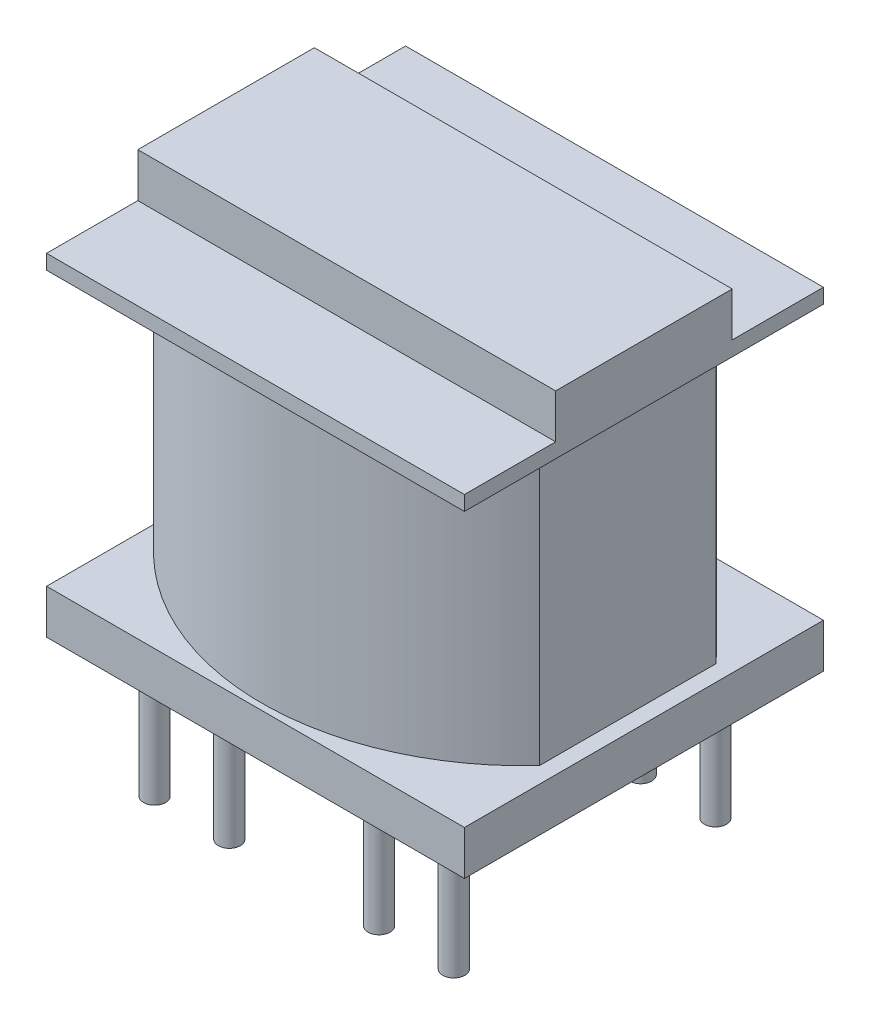
ISO-10303-21;
HEADER;
FILE_DESCRIPTION(('STEP AP214'),'2;1');
FILE_NAME('part.step','',(''),(''),'','','');
FILE_SCHEMA(('AUTOMOTIVE_DESIGN { 1 0 10303 214 1 1 1 1 }'));
ENDSEC;
DATA;
#1=APPLICATION_CONTEXT('core data for automotive mechanical design processes');
#2=APPLICATION_PROTOCOL_DEFINITION('international standard','automotive_design',2000,#1);
#3=PRODUCT_CONTEXT('',#1,'mechanical');
#4=PRODUCT('Part','Part','',(#3));
#5=PRODUCT_RELATED_PRODUCT_CATEGORY('part','',(#4));
#6=PRODUCT_DEFINITION_FORMATION('','',#4);
#7=PRODUCT_DEFINITION_CONTEXT('part definition',#1,'design');
#8=PRODUCT_DEFINITION('design','',#6,#7);
#9=PRODUCT_DEFINITION_SHAPE('','',#8);
#10=(LENGTH_UNIT() NAMED_UNIT(*) SI_UNIT(.MILLI.,.METRE.));
#11=(NAMED_UNIT(*) PLANE_ANGLE_UNIT() SI_UNIT($,.RADIAN.));
#12=(NAMED_UNIT(*) SI_UNIT($,.STERADIAN.) SOLID_ANGLE_UNIT());
#13=UNCERTAINTY_MEASURE_WITH_UNIT(LENGTH_MEASURE(1.E-05),#10,'distance_accuracy_value','');
#14=(GEOMETRIC_REPRESENTATION_CONTEXT(3) GLOBAL_UNCERTAINTY_ASSIGNED_CONTEXT((#13)) GLOBAL_UNIT_ASSIGNED_CONTEXT((#10,
#11,#12)) REPRESENTATION_CONTEXT('',''));
#15=CARTESIAN_POINT('',(0.,0.,0.));
#16=DIRECTION('',(0.,0.,1.));
#17=DIRECTION('',(1.,0.,0.));
#18=AXIS2_PLACEMENT_3D('',#15,#16,#17);
#19=CARTESIAN_POINT('',(0.,0.,0.));
#20=DIRECTION('',(0.,1.,0.));
#21=DIRECTION('',(0.,0.,1.));
#22=AXIS2_PLACEMENT_3D('',#19,#20,#21);
#23=PLANE('',#22);
#24=CARTESIAN_POINT('',(-2.54500000000001,0.,-4.445));
#25=DIRECTION('',(0.,1.,0.));
#26=DIRECTION('',(0.,0.,1.));
#27=AXIS2_PLACEMENT_3D('',#24,#25,#26);
#28=CIRCLE('',#27,0.375);
#29=CARTESIAN_POINT('',(-2.54500000000001,0.,-4.07));
#30=VERTEX_POINT('',#29);
#31=EDGE_CURVE('E47',#30,#30,#28,.F.);
#32=ORIENTED_EDGE('',*,*,#31,.F.);
#33=EDGE_LOOP('',(#32));
#34=FACE_BOUND('',#33,.T.);
#35=CARTESIAN_POINT('',(5.08499999999999,0.,-4.445));
#36=DIRECTION('',(0.,1.,0.));
#37=DIRECTION('',(0.,0.,1.));
#38=AXIS2_PLACEMENT_3D('',#35,#36,#37);
#39=CIRCLE('',#38,0.375);
#40=CARTESIAN_POINT('',(5.08499999999999,0.,-4.07));
#41=VERTEX_POINT('',#40);
#42=EDGE_CURVE('E276',#41,#41,#39,.F.);
#43=ORIENTED_EDGE('',*,*,#42,.F.);
#44=EDGE_LOOP('',(#43));
#45=FACE_BOUND('',#44,.T.);
#46=CARTESIAN_POINT('',(2.545,0.,4.445));
#47=DIRECTION('',(0.,1.,0.));
#48=DIRECTION('',(0.,0.,1.));
#49=AXIS2_PLACEMENT_3D('',#46,#47,#48);
#50=CIRCLE('',#49,0.375);
#51=CARTESIAN_POINT('',(2.545,0.,4.82));
#52=VERTEX_POINT('',#51);
#53=EDGE_CURVE('E270',#52,#52,#50,.F.);
#54=ORIENTED_EDGE('',*,*,#53,.F.);
#55=EDGE_LOOP('',(#54));
#56=FACE_BOUND('',#55,.T.);
#57=CARTESIAN_POINT('',(-5.085,0.,4.445));
#58=DIRECTION('',(0.,1.,0.));
#59=DIRECTION('',(0.,0.,1.));
#60=AXIS2_PLACEMENT_3D('',#57,#58,#59);
#61=CIRCLE('',#60,0.375);
#62=CARTESIAN_POINT('',(-5.085,0.,4.82));
#63=VERTEX_POINT('',#62);
#64=EDGE_CURVE('E264',#63,#63,#61,.F.);
#65=ORIENTED_EDGE('',*,*,#64,.F.);
#66=EDGE_LOOP('',(#65));
#67=FACE_BOUND('',#66,.T.);
#68=DIRECTION('',(0.,0.,1.));
#69=VECTOR('',#68,1.);
#70=CARTESIAN_POINT('',(-7.1,0.,-6.1));
#71=LINE('',#70,#69);
#72=CARTESIAN_POINT('',(-7.1,0.,-6.1));
#73=VERTEX_POINT('',#72);
#74=CARTESIAN_POINT('',(-7.1,0.,6.1));
#75=VERTEX_POINT('',#74);
#76=EDGE_CURVE('E226',#73,#75,#71,.T.);
#77=ORIENTED_EDGE('',*,*,#76,.F.);
#78=DIRECTION('',(-1.,0.,0.));
#79=VECTOR('',#78,1.);
#80=CARTESIAN_POINT('',(-7.1,0.,-6.1));
#81=LINE('',#80,#79);
#82=CARTESIAN_POINT('',(7.1,0.,-6.1));
#83=VERTEX_POINT('',#82);
#84=EDGE_CURVE('E222',#83,#73,#81,.T.);
#85=ORIENTED_EDGE('',*,*,#84,.F.);
#86=DIRECTION('',(0.,0.,-1.));
#87=VECTOR('',#86,1.);
#88=CARTESIAN_POINT('',(7.1,0.,-6.1));
#89=LINE('',#88,#87);
#90=CARTESIAN_POINT('',(7.1,0.,6.1));
#91=VERTEX_POINT('',#90);
#92=EDGE_CURVE('E232',#91,#83,#89,.T.);
#93=ORIENTED_EDGE('',*,*,#92,.F.);
#94=DIRECTION('',(1.,0.,0.));
#95=VECTOR('',#94,1.);
#96=CARTESIAN_POINT('',(-7.1,0.,6.1));
#97=LINE('',#96,#95);
#98=EDGE_CURVE('E229',#75,#91,#97,.T.);
#99=ORIENTED_EDGE('',*,*,#98,.F.);
#100=EDGE_LOOP('',(#77,#85,#93,#99));
#101=FACE_BOUND('',#100,.T.);
#102=CARTESIAN_POINT('',(-2.545,0.,4.445));
#103=DIRECTION('',(0.,1.,0.));
#104=DIRECTION('',(0.,0.,1.));
#105=AXIS2_PLACEMENT_3D('',#102,#103,#104);
#106=CIRCLE('',#105,0.375);
#107=CARTESIAN_POINT('',(-2.545,0.,4.82));
#108=VERTEX_POINT('',#107);
#109=EDGE_CURVE('E267',#108,#108,#106,.F.);
#110=ORIENTED_EDGE('',*,*,#109,.F.);
#111=EDGE_LOOP('',(#110));
#112=FACE_BOUND('',#111,.T.);
#113=CARTESIAN_POINT('',(5.085,0.,4.445));
#114=DIRECTION('',(0.,1.,0.));
#115=DIRECTION('',(0.,0.,1.));
#116=AXIS2_PLACEMENT_3D('',#113,#114,#115);
#117=CIRCLE('',#116,0.375);
#118=CARTESIAN_POINT('',(5.085,0.,4.82));
#119=VERTEX_POINT('',#118);
#120=EDGE_CURVE('E273',#119,#119,#117,.F.);
#121=ORIENTED_EDGE('',*,*,#120,.F.);
#122=EDGE_LOOP('',(#121));
#123=FACE_BOUND('',#122,.T.);
#124=CARTESIAN_POINT('',(2.54499999999999,0.,-4.445));
#125=DIRECTION('',(0.,1.,0.));
#126=DIRECTION('',(0.,0.,1.));
#127=AXIS2_PLACEMENT_3D('',#124,#125,#126);
#128=CIRCLE('',#127,0.375);
#129=CARTESIAN_POINT('',(2.54499999999999,0.,-4.07));
#130=VERTEX_POINT('',#129);
#131=EDGE_CURVE('E279',#130,#130,#128,.F.);
#132=ORIENTED_EDGE('',*,*,#131,.F.);
#133=EDGE_LOOP('',(#132));
#134=FACE_BOUND('',#133,.T.);
#135=CARTESIAN_POINT('',(-5.08500000000001,0.,-4.445));
#136=DIRECTION('',(0.,1.,0.));
#137=DIRECTION('',(0.,0.,1.));
#138=AXIS2_PLACEMENT_3D('',#135,#136,#137);
#139=CIRCLE('',#138,0.375);
#140=CARTESIAN_POINT('',(-5.08500000000001,0.,-4.07));
#141=VERTEX_POINT('',#140);
#142=EDGE_CURVE('E13',#141,#141,#139,.F.);
#143=ORIENTED_EDGE('',*,*,#142,.F.);
#144=EDGE_LOOP('',(#143));
#145=FACE_BOUND('',#144,.T.);
#146=ADVANCED_FACE('F39',(#34,#45,#56,#67,#101,#112,#123,#134,#145),#23,.F.);
#147=CARTESIAN_POINT('',(-7.1,12.8,-6.1));
#148=DIRECTION('',(1.,0.,0.));
#149=DIRECTION('',(0.,0.,-1.));
#150=AXIS2_PLACEMENT_3D('',#147,#148,#149);
#151=PLANE('',#150);
#152=DIRECTION('',(0.,-1.,0.));
#153=VECTOR('',#152,1.);
#154=CARTESIAN_POINT('',(-7.1,12.8,-6.1));
#155=LINE('',#154,#153);
#156=CARTESIAN_POINT('',(-7.1,11.3,-6.1));
#157=VERTEX_POINT('',#156);
#158=CARTESIAN_POINT('',(-7.1,10.8,-6.1));
#159=VERTEX_POINT('',#158);
#160=EDGE_CURVE('E237',#157,#159,#155,.T.);
#161=ORIENTED_EDGE('',*,*,#160,.T.);
#162=DIRECTION('',(0.,0.,1.));
#163=VECTOR('',#162,1.);
#164=CARTESIAN_POINT('',(-7.1,10.8,-6.1));
#165=LINE('',#164,#163);
#166=CARTESIAN_POINT('',(-7.1,10.8,6.1));
#167=VERTEX_POINT('',#166);
#168=EDGE_CURVE('E54',#159,#167,#165,.T.);
#169=ORIENTED_EDGE('',*,*,#168,.T.);
#170=DIRECTION('',(0.,-1.,0.));
#171=VECTOR('',#170,1.);
#172=CARTESIAN_POINT('',(-7.1,12.8,6.1));
#173=LINE('',#172,#171);
#174=CARTESIAN_POINT('',(-7.1,11.3,6.1));
#175=VERTEX_POINT('',#174);
#176=EDGE_CURVE('E249',#175,#167,#173,.T.);
#177=ORIENTED_EDGE('',*,*,#176,.F.);
#178=DIRECTION('',(0.,0.,1.));
#179=VECTOR('',#178,1.);
#180=CARTESIAN_POINT('',(-7.1,11.3,-6.1));
#181=LINE('',#180,#179);
#182=CARTESIAN_POINT('',(-7.1,11.3,3.));
#183=VERTEX_POINT('',#182);
#184=EDGE_CURVE('E215',#183,#175,#181,.T.);
#185=ORIENTED_EDGE('',*,*,#184,.F.);
#186=DIRECTION('',(0.,-1.,0.));
#187=VECTOR('',#186,1.);
#188=CARTESIAN_POINT('',(-7.1,12.8,3.));
#189=LINE('',#188,#187);
#190=CARTESIAN_POINT('',(-7.1,12.8,3.));
#191=VERTEX_POINT('',#190);
#192=EDGE_CURVE('E204',#191,#183,#189,.T.);
#193=ORIENTED_EDGE('',*,*,#192,.F.);
#194=DIRECTION('',(0.,0.,1.));
#195=VECTOR('',#194,1.);
#196=CARTESIAN_POINT('',(-7.1,12.8,-6.1));
#197=LINE('',#196,#195);
#198=CARTESIAN_POINT('',(-7.1,12.8,-3.));
#199=VERTEX_POINT('',#198);
#200=EDGE_CURVE('E218',#199,#191,#197,.T.);
#201=ORIENTED_EDGE('',*,*,#200,.F.);
#202=DIRECTION('',(0.,1.,0.));
#203=VECTOR('',#202,1.);
#204=CARTESIAN_POINT('',(-7.1,12.8,-3.));
#205=LINE('',#204,#203);
#206=CARTESIAN_POINT('',(-7.1,11.3,-3.));
#207=VERTEX_POINT('',#206);
#208=EDGE_CURVE('E208',#207,#199,#205,.T.);
#209=ORIENTED_EDGE('',*,*,#208,.F.);
#210=EDGE_CURVE('E212',#157,#207,#181,.T.);
#211=ORIENTED_EDGE('',*,*,#210,.F.);
#212=EDGE_LOOP('',(#161,#169,#177,#185,#193,#201,#209,#211));
#213=FACE_BOUND('',#212,.T.);
#214=ADVANCED_FACE('F41',(#213),#151,.F.);
#215=CARTESIAN_POINT('',(-7.1,12.8,6.1));
#216=DIRECTION('',(0.,0.,-1.));
#217=DIRECTION('',(-1.,0.,0.));
#218=AXIS2_PLACEMENT_3D('',#215,#216,#217);
#219=PLANE('',#218);
#220=ORIENTED_EDGE('',*,*,#176,.T.);
#221=DIRECTION('',(1.,0.,0.));
#222=VECTOR('',#221,1.);
#223=CARTESIAN_POINT('',(-7.1,10.8,6.1));
#224=LINE('',#223,#222);
#225=CARTESIAN_POINT('',(7.1,10.8,6.1));
#226=VERTEX_POINT('',#225);
#227=EDGE_CURVE('E187',#167,#226,#224,.T.);
#228=ORIENTED_EDGE('',*,*,#227,.T.);
#229=DIRECTION('',(0.,-1.,0.));
#230=VECTOR('',#229,1.);
#231=CARTESIAN_POINT('',(7.1,12.8,6.1));
#232=LINE('',#231,#230);
#233=CARTESIAN_POINT('',(7.1,11.3,6.1));
#234=VERTEX_POINT('',#233);
#235=EDGE_CURVE('E245',#234,#226,#232,.T.);
#236=ORIENTED_EDGE('',*,*,#235,.F.);
#237=DIRECTION('',(1.,0.,0.));
#238=VECTOR('',#237,1.);
#239=CARTESIAN_POINT('',(-7.1,11.3,6.1));
#240=LINE('',#239,#238);
#241=EDGE_CURVE('E216',#175,#234,#240,.T.);
#242=ORIENTED_EDGE('',*,*,#241,.F.);
#243=EDGE_LOOP('',(#220,#228,#236,#242));
#244=FACE_BOUND('',#243,.T.);
#245=ADVANCED_FACE('F417',(#244),#219,.F.);
#246=CARTESIAN_POINT('',(7.1,12.8,-6.1));
#247=DIRECTION('',(-1.,0.,0.));
#248=DIRECTION('',(0.,0.,1.));
#249=AXIS2_PLACEMENT_3D('',#246,#247,#248);
#250=PLANE('',#249);
#251=ORIENTED_EDGE('',*,*,#235,.T.);
#252=DIRECTION('',(0.,0.,-1.));
#253=VECTOR('',#252,1.);
#254=CARTESIAN_POINT('',(7.1,10.8,-6.1));
#255=LINE('',#254,#253);
#256=CARTESIAN_POINT('',(7.1,10.8,-6.1));
#257=VERTEX_POINT('',#256);
#258=EDGE_CURVE('E162',#226,#257,#255,.T.);
#259=ORIENTED_EDGE('',*,*,#258,.T.);
#260=DIRECTION('',(0.,-1.,0.));
#261=VECTOR('',#260,1.);
#262=CARTESIAN_POINT('',(7.1,12.8,-6.1));
#263=LINE('',#262,#261);
#264=CARTESIAN_POINT('',(7.1,11.3,-6.1));
#265=VERTEX_POINT('',#264);
#266=EDGE_CURVE('E241',#265,#257,#263,.T.);
#267=ORIENTED_EDGE('',*,*,#266,.F.);
#268=DIRECTION('',(0.,0.,-1.));
#269=VECTOR('',#268,1.);
#270=CARTESIAN_POINT('',(7.1,11.3,-6.1));
#271=LINE('',#270,#269);
#272=CARTESIAN_POINT('',(7.1,11.3,-3.));
#273=VERTEX_POINT('',#272);
#274=EDGE_CURVE('E210',#273,#265,#271,.T.);
#275=ORIENTED_EDGE('',*,*,#274,.F.);
#276=DIRECTION('',(0.,-1.,0.));
#277=VECTOR('',#276,1.);
#278=CARTESIAN_POINT('',(7.1,12.8,-3.));
#279=LINE('',#278,#277);
#280=CARTESIAN_POINT('',(7.1,12.8,-3.));
#281=VERTEX_POINT('',#280);
#282=EDGE_CURVE('E206',#281,#273,#279,.T.);
#283=ORIENTED_EDGE('',*,*,#282,.F.);
#284=DIRECTION('',(0.,0.,-1.));
#285=VECTOR('',#284,1.);
#286=CARTESIAN_POINT('',(7.1,12.8,-6.1));
#287=LINE('',#286,#285);
#288=CARTESIAN_POINT('',(7.1,12.8,3.));
#289=VERTEX_POINT('',#288);
#290=EDGE_CURVE('E221',#289,#281,#287,.T.);
#291=ORIENTED_EDGE('',*,*,#290,.F.);
#292=DIRECTION('',(0.,1.,0.));
#293=VECTOR('',#292,1.);
#294=CARTESIAN_POINT('',(7.1,12.8,3.));
#295=LINE('',#294,#293);
#296=CARTESIAN_POINT('',(7.1,11.3,3.));
#297=VERTEX_POINT('',#296);
#298=EDGE_CURVE('E202',#297,#289,#295,.T.);
#299=ORIENTED_EDGE('',*,*,#298,.F.);
#300=EDGE_CURVE('E213',#234,#297,#271,.T.);
#301=ORIENTED_EDGE('',*,*,#300,.F.);
#302=EDGE_LOOP('',(#251,#259,#267,#275,#283,#291,#299,#301));
#303=FACE_BOUND('',#302,.T.);
#304=ADVANCED_FACE('F414',(#303),#250,.F.);
#305=CARTESIAN_POINT('',(-7.1,12.8,-6.1));
#306=DIRECTION('',(0.,0.,1.));
#307=DIRECTION('',(1.,0.,0.));
#308=AXIS2_PLACEMENT_3D('',#305,#306,#307);
#309=PLANE('',#308);
#310=ORIENTED_EDGE('',*,*,#266,.T.);
#311=DIRECTION('',(-1.,0.,0.));
#312=VECTOR('',#311,1.);
#313=CARTESIAN_POINT('',(-7.1,10.8,-6.1));
#314=LINE('',#313,#312);
#315=EDGE_CURVE('E260',#257,#159,#314,.T.);
#316=ORIENTED_EDGE('',*,*,#315,.T.);
#317=ORIENTED_EDGE('',*,*,#160,.F.);
#318=DIRECTION('',(-1.,0.,0.));
#319=VECTOR('',#318,1.);
#320=CARTESIAN_POINT('',(-7.1,11.3,-6.1));
#321=LINE('',#320,#319);
#322=EDGE_CURVE('E258',#265,#157,#321,.T.);
#323=ORIENTED_EDGE('',*,*,#322,.F.);
#324=EDGE_LOOP('',(#310,#316,#317,#323));
#325=FACE_BOUND('',#324,.T.);
#326=ADVANCED_FACE('F409',(#325),#309,.F.);
#327=CARTESIAN_POINT('',(0.,12.8,0.));
#328=DIRECTION('',(0.,1.,0.));
#329=DIRECTION('',(0.,0.,1.));
#330=AXIS2_PLACEMENT_3D('',#327,#328,#329);
#331=PLANE('',#330);
#332=ORIENTED_EDGE('',*,*,#290,.T.);
#333=DIRECTION('',(-1.,0.,0.));
#334=VECTOR('',#333,1.);
#335=CARTESIAN_POINT('',(0.,12.8,-3.));
#336=LINE('',#335,#334);
#337=EDGE_CURVE('E255',#281,#199,#336,.T.);
#338=ORIENTED_EDGE('',*,*,#337,.T.);
#339=ORIENTED_EDGE('',*,*,#200,.T.);
#340=DIRECTION('',(1.,0.,0.));
#341=VECTOR('',#340,1.);
#342=CARTESIAN_POINT('',(0.,12.8,3.));
#343=LINE('',#342,#341);
#344=EDGE_CURVE('E252',#191,#289,#343,.T.);
#345=ORIENTED_EDGE('',*,*,#344,.T.);
#346=EDGE_LOOP('',(#332,#338,#339,#345));
#347=FACE_BOUND('',#346,.T.);
#348=ADVANCED_FACE('F403',(#347),#331,.T.);
#349=CARTESIAN_POINT('',(-10.1888899251384,11.3,3.));
#350=DIRECTION('',(0.,0.,1.));
#351=DIRECTION('',(1.,0.,0.));
#352=AXIS2_PLACEMENT_3D('',#349,#350,#351);
#353=PLANE('',#352);
#354=ORIENTED_EDGE('',*,*,#192,.T.);
#355=DIRECTION('',(1.,0.,0.));
#356=VECTOR('',#355,1.);
#357=CARTESIAN_POINT('',(-10.1888899251384,11.3,3.));
#358=LINE('',#357,#356);
#359=EDGE_CURVE('E196',#183,#297,#358,.T.);
#360=ORIENTED_EDGE('',*,*,#359,.T.);
#361=ORIENTED_EDGE('',*,*,#298,.T.);
#362=ORIENTED_EDGE('',*,*,#344,.F.);
#363=EDGE_LOOP('',(#354,#360,#361,#362));
#364=FACE_BOUND('',#363,.T.);
#365=ADVANCED_FACE('F399',(#364),#353,.T.);
#366=CARTESIAN_POINT('',(0.0493408713081768,11.3,0.));
#367=DIRECTION('',(0.,1.,0.));
#368=DIRECTION('',(0.,0.,1.));
#369=AXIS2_PLACEMENT_3D('',#366,#367,#368);
#370=PLANE('',#369);
#371=ORIENTED_EDGE('',*,*,#184,.T.);
#372=ORIENTED_EDGE('',*,*,#241,.T.);
#373=ORIENTED_EDGE('',*,*,#300,.T.);
#374=ORIENTED_EDGE('',*,*,#359,.F.);
#375=EDGE_LOOP('',(#371,#372,#373,#374));
#376=FACE_BOUND('',#375,.T.);
#377=ADVANCED_FACE('F402',(#376),#370,.T.);
#378=ORIENTED_EDGE('',*,*,#210,.T.);
#379=DIRECTION('',(-1.,0.,0.));
#380=VECTOR('',#379,1.);
#381=CARTESIAN_POINT('',(-10.1888899251384,11.3,-3.));
#382=LINE('',#381,#380);
#383=EDGE_CURVE('E199',#273,#207,#382,.T.);
#384=ORIENTED_EDGE('',*,*,#383,.F.);
#385=ORIENTED_EDGE('',*,*,#274,.T.);
#386=ORIENTED_EDGE('',*,*,#322,.T.);
#387=EDGE_LOOP('',(#378,#384,#385,#386));
#388=FACE_BOUND('',#387,.T.);
#389=ADVANCED_FACE('F397',(#388),#370,.T.);
#390=CARTESIAN_POINT('',(-10.1888899251384,11.3,-3.));
#391=DIRECTION('',(0.,0.,-1.));
#392=DIRECTION('',(-1.,0.,0.));
#393=AXIS2_PLACEMENT_3D('',#390,#391,#392);
#394=PLANE('',#393);
#395=ORIENTED_EDGE('',*,*,#208,.T.);
#396=ORIENTED_EDGE('',*,*,#337,.F.);
#397=ORIENTED_EDGE('',*,*,#282,.T.);
#398=ORIENTED_EDGE('',*,*,#383,.T.);
#399=EDGE_LOOP('',(#395,#396,#397,#398));
#400=FACE_BOUND('',#399,.T.);
#401=ADVANCED_FACE('F393',(#400),#394,.T.);
#402=CARTESIAN_POINT('',(1.01389512793061,1.5,0.37449721322909));
#403=DIRECTION('',(0.,1.,0.));
#404=DIRECTION('',(0.,0.,1.));
#405=AXIS2_PLACEMENT_3D('',#402,#403,#404);
#406=PLANE('',#405);
#407=CARTESIAN_POINT('',(0.,1.5,3.));
#408=DIRECTION('',(0.,1.,0.));
#409=DIRECTION('',(0.,0.,-1.));
#410=AXIS2_PLACEMENT_3D('',#407,#408,#409);
#411=CIRCLE('',#410,8.88580434253526);
#412=CARTESIAN_POINT('',(6.55419856380767,1.5,-3.));
#413=VERTEX_POINT('',#412);
#414=CARTESIAN_POINT('',(-6.55419856380767,1.5,-3.));
#415=VERTEX_POINT('',#414);
#416=EDGE_CURVE('E677',#413,#415,#411,.T.);
#417=ORIENTED_EDGE('',*,*,#416,.F.);
#418=DIRECTION('',(0.,0.,-1.));
#419=VECTOR('',#418,1.);
#420=CARTESIAN_POINT('',(6.55419856380767,1.5,-3.));
#421=LINE('',#420,#419);
#422=CARTESIAN_POINT('',(6.55419856380767,1.5,3.));
#423=VERTEX_POINT('',#422);
#424=EDGE_CURVE('E180',#423,#413,#421,.T.);
#425=ORIENTED_EDGE('',*,*,#424,.F.);
#426=CARTESIAN_POINT('',(0.,1.5,-3.));
#427=DIRECTION('',(0.,1.,0.));
#428=DIRECTION('',(0.,0.,1.));
#429=AXIS2_PLACEMENT_3D('',#426,#427,#428);
#430=CIRCLE('',#429,8.88580434253526);
#431=CARTESIAN_POINT('',(-6.55419856380767,1.5,3.));
#432=VERTEX_POINT('',#431);
#433=EDGE_CURVE('E176',#432,#423,#430,.T.);
#434=ORIENTED_EDGE('',*,*,#433,.F.);
#435=DIRECTION('',(0.,0.,1.));
#436=VECTOR('',#435,1.);
#437=CARTESIAN_POINT('',(-6.55419856380767,1.5,-3.));
#438=LINE('',#437,#436);
#439=EDGE_CURVE('E679',#415,#432,#438,.T.);
#440=ORIENTED_EDGE('',*,*,#439,.F.);
#441=EDGE_LOOP('',(#417,#425,#434,#440));
#442=FACE_BOUND('',#441,.T.);
#443=DIRECTION('',(0.,0.,1.));
#444=VECTOR('',#443,1.);
#445=CARTESIAN_POINT('',(-7.1,1.5,-6.1));
#446=LINE('',#445,#444);
#447=CARTESIAN_POINT('',(-7.1,1.5,-6.1));
#448=VERTEX_POINT('',#447);
#449=CARTESIAN_POINT('',(-7.1,1.5,6.1));
#450=VERTEX_POINT('',#449);
#451=EDGE_CURVE('E194',#448,#450,#446,.T.);
#452=ORIENTED_EDGE('',*,*,#451,.T.);
#453=DIRECTION('',(1.,0.,0.));
#454=VECTOR('',#453,1.);
#455=CARTESIAN_POINT('',(-7.1,1.5,6.1));
#456=LINE('',#455,#454);
#457=CARTESIAN_POINT('',(7.1,1.5,6.1));
#458=VERTEX_POINT('',#457);
#459=EDGE_CURVE('E192',#450,#458,#456,.T.);
#460=ORIENTED_EDGE('',*,*,#459,.T.);
#461=DIRECTION('',(0.,0.,-1.));
#462=VECTOR('',#461,1.);
#463=CARTESIAN_POINT('',(7.1,1.5,-6.1));
#464=LINE('',#463,#462);
#465=CARTESIAN_POINT('',(7.1,1.5,-6.1));
#466=VERTEX_POINT('',#465);
#467=EDGE_CURVE('E62',#458,#466,#464,.T.);
#468=ORIENTED_EDGE('',*,*,#467,.T.);
#469=DIRECTION('',(-1.,0.,0.));
#470=VECTOR('',#469,1.);
#471=CARTESIAN_POINT('',(-7.1,1.5,-6.1));
#472=LINE('',#471,#470);
#473=EDGE_CURVE('E262',#466,#448,#472,.T.);
#474=ORIENTED_EDGE('',*,*,#473,.T.);
#475=EDGE_LOOP('',(#452,#460,#468,#474));
#476=FACE_BOUND('',#475,.T.);
#477=ADVANCED_FACE('F377',(#442,#476),#406,.T.);
#478=CARTESIAN_POINT('',(0.0493408713081768,10.8,0.));
#479=DIRECTION('',(0.,1.,0.));
#480=DIRECTION('',(0.,0.,1.));
#481=AXIS2_PLACEMENT_3D('',#478,#479,#480);
#482=PLANE('',#481);
#483=CARTESIAN_POINT('',(0.,10.8,3.));
#484=DIRECTION('',(0.,1.,0.));
#485=DIRECTION('',(0.,0.,1.));
#486=AXIS2_PLACEMENT_3D('',#483,#484,#485);
#487=CIRCLE('',#486,8.88580434253526);
#488=CARTESIAN_POINT('',(6.55419856380767,10.8,-3.));
#489=VERTEX_POINT('',#488);
#490=CARTESIAN_POINT('',(-6.55419856380767,10.8,-3.));
#491=VERTEX_POINT('',#490);
#492=EDGE_CURVE('E681',#489,#491,#487,.T.);
#493=ORIENTED_EDGE('',*,*,#492,.T.);
#494=DIRECTION('',(0.,0.,1.));
#495=VECTOR('',#494,1.);
#496=CARTESIAN_POINT('',(-6.55419856380767,10.8,-3.));
#497=LINE('',#496,#495);
#498=CARTESIAN_POINT('',(-6.55419856380767,10.8,3.));
#499=VERTEX_POINT('',#498);
#500=EDGE_CURVE('E168',#491,#499,#497,.T.);
#501=ORIENTED_EDGE('',*,*,#500,.T.);
#502=CARTESIAN_POINT('',(0.,10.8,-3.));
#503=DIRECTION('',(0.,1.,0.));
#504=DIRECTION('',(0.,0.,1.));
#505=AXIS2_PLACEMENT_3D('',#502,#503,#504);
#506=CIRCLE('',#505,8.88580434253526);
#507=CARTESIAN_POINT('',(6.55419856380767,10.8,3.));
#508=VERTEX_POINT('',#507);
#509=EDGE_CURVE('E166',#499,#508,#506,.T.);
#510=ORIENTED_EDGE('',*,*,#509,.T.);
#511=DIRECTION('',(0.,0.,-1.));
#512=VECTOR('',#511,1.);
#513=CARTESIAN_POINT('',(6.55419856380767,10.8,-3.));
#514=LINE('',#513,#512);
#515=EDGE_CURVE('E152',#508,#489,#514,.T.);
#516=ORIENTED_EDGE('',*,*,#515,.T.);
#517=EDGE_LOOP('',(#493,#501,#510,#516));
#518=FACE_BOUND('',#517,.T.);
#519=ORIENTED_EDGE('',*,*,#315,.F.);
#520=ORIENTED_EDGE('',*,*,#258,.F.);
#521=ORIENTED_EDGE('',*,*,#227,.F.);
#522=ORIENTED_EDGE('',*,*,#168,.F.);
#523=EDGE_LOOP('',(#519,#520,#521,#522));
#524=FACE_BOUND('',#523,.T.);
#525=ADVANCED_FACE('F167',(#518,#524),#482,.F.);
#526=CARTESIAN_POINT('',(6.55419856380767,39.1007945971932,-3.));
#527=DIRECTION('',(-1.,0.,0.));
#528=DIRECTION('',(0.,0.,1.));
#529=AXIS2_PLACEMENT_3D('',#526,#527,#528);
#530=PLANE('',#529);
#531=DIRECTION('',(0.,-1.,0.));
#532=VECTOR('',#531,1.);
#533=CARTESIAN_POINT('',(6.55419856380767,39.1007945971932,3.));
#534=LINE('',#533,#532);
#535=EDGE_CURVE('E157',#508,#423,#534,.T.);
#536=ORIENTED_EDGE('',*,*,#535,.T.);
#537=ORIENTED_EDGE('',*,*,#424,.T.);
#538=DIRECTION('',(0.,-1.,0.));
#539=VECTOR('',#538,1.);
#540=CARTESIAN_POINT('',(6.55419856380767,39.1007945971932,-3.));
#541=LINE('',#540,#539);
#542=EDGE_CURVE('E159',#489,#413,#541,.T.);
#543=ORIENTED_EDGE('',*,*,#542,.F.);
#544=ORIENTED_EDGE('',*,*,#515,.F.);
#545=EDGE_LOOP('',(#536,#537,#543,#544));
#546=FACE_BOUND('',#545,.T.);
#547=ADVANCED_FACE('F154',(#546),#530,.F.);
#548=CARTESIAN_POINT('',(0.,39.1007945971932,-3.));
#549=DIRECTION('',(0.,-1.,0.));
#550=DIRECTION('',(0.,0.,-1.));
#551=AXIS2_PLACEMENT_3D('',#548,#549,#550);
#552=CYLINDRICAL_SURFACE('',#551,8.88580434253526);
#553=DIRECTION('',(0.,-1.,0.));
#554=VECTOR('',#553,1.);
#555=CARTESIAN_POINT('',(-6.55419856380767,39.1007945971932,3.));
#556=LINE('',#555,#554);
#557=EDGE_CURVE('E177',#499,#432,#556,.T.);
#558=ORIENTED_EDGE('',*,*,#557,.T.);
#559=ORIENTED_EDGE('',*,*,#433,.T.);
#560=ORIENTED_EDGE('',*,*,#535,.F.);
#561=ORIENTED_EDGE('',*,*,#509,.F.);
#562=EDGE_LOOP('',(#558,#559,#560,#561));
#563=FACE_BOUND('',#562,.T.);
#564=ADVANCED_FACE('F174',(#563),#552,.T.);
#565=CARTESIAN_POINT('',(-6.55419856380767,39.1007945971932,-3.));
#566=DIRECTION('',(1.,0.,0.));
#567=DIRECTION('',(0.,0.,-1.));
#568=AXIS2_PLACEMENT_3D('',#565,#566,#567);
#569=PLANE('',#568);
#570=DIRECTION('',(0.,-1.,0.));
#571=VECTOR('',#570,1.);
#572=CARTESIAN_POINT('',(-6.55419856380767,39.1007945971932,-3.));
#573=LINE('',#572,#571);
#574=EDGE_CURVE('E163',#491,#415,#573,.T.);
#575=ORIENTED_EDGE('',*,*,#574,.T.);
#576=ORIENTED_EDGE('',*,*,#439,.T.);
#577=ORIENTED_EDGE('',*,*,#557,.F.);
#578=ORIENTED_EDGE('',*,*,#500,.F.);
#579=EDGE_LOOP('',(#575,#576,#577,#578));
#580=FACE_BOUND('',#579,.T.);
#581=ADVANCED_FACE('F382',(#580),#569,.F.);
#582=CARTESIAN_POINT('',(0.,39.1007945971932,3.));
#583=DIRECTION('',(0.,-1.,0.));
#584=DIRECTION('',(0.,0.,-1.));
#585=AXIS2_PLACEMENT_3D('',#582,#583,#584);
#586=CYLINDRICAL_SURFACE('',#585,8.88580434253526);
#587=ORIENTED_EDGE('',*,*,#542,.T.);
#588=ORIENTED_EDGE('',*,*,#416,.T.);
#589=ORIENTED_EDGE('',*,*,#574,.F.);
#590=ORIENTED_EDGE('',*,*,#492,.F.);
#591=EDGE_LOOP('',(#587,#588,#589,#590));
#592=FACE_BOUND('',#591,.T.);
#593=ADVANCED_FACE('F385',(#592),#586,.T.);
#594=ORIENTED_EDGE('',*,*,#473,.F.);
#595=EDGE_CURVE('E240',#466,#83,#263,.T.);
#596=ORIENTED_EDGE('',*,*,#595,.T.);
#597=ORIENTED_EDGE('',*,*,#84,.T.);
#598=EDGE_CURVE('E225',#448,#73,#155,.T.);
#599=ORIENTED_EDGE('',*,*,#598,.F.);
#600=EDGE_LOOP('',(#594,#596,#597,#599));
#601=FACE_BOUND('',#600,.T.);
#602=ADVANCED_FACE('F389',(#601),#309,.F.);
#603=ORIENTED_EDGE('',*,*,#467,.F.);
#604=EDGE_CURVE('E244',#458,#91,#232,.T.);
#605=ORIENTED_EDGE('',*,*,#604,.T.);
#606=ORIENTED_EDGE('',*,*,#92,.T.);
#607=ORIENTED_EDGE('',*,*,#595,.F.);
#608=EDGE_LOOP('',(#603,#605,#606,#607));
#609=FACE_BOUND('',#608,.T.);
#610=ADVANCED_FACE('F419',(#609),#250,.F.);
#611=ORIENTED_EDGE('',*,*,#459,.F.);
#612=EDGE_CURVE('E248',#450,#75,#173,.T.);
#613=ORIENTED_EDGE('',*,*,#612,.T.);
#614=ORIENTED_EDGE('',*,*,#98,.T.);
#615=ORIENTED_EDGE('',*,*,#604,.F.);
#616=EDGE_LOOP('',(#611,#613,#614,#615));
#617=FACE_BOUND('',#616,.T.);
#618=ADVANCED_FACE('F422',(#617),#219,.F.);
#619=ORIENTED_EDGE('',*,*,#451,.F.);
#620=ORIENTED_EDGE('',*,*,#598,.T.);
#621=ORIENTED_EDGE('',*,*,#76,.T.);
#622=ORIENTED_EDGE('',*,*,#612,.F.);
#623=EDGE_LOOP('',(#619,#620,#621,#622));
#624=FACE_BOUND('',#623,.T.);
#625=ADVANCED_FACE('F373',(#624),#151,.F.);
#626=CARTESIAN_POINT('',(-5.085,-4.5,4.445));
#627=DIRECTION('',(0.,1.,0.));
#628=DIRECTION('',(0.,0.,1.));
#629=AXIS2_PLACEMENT_3D('',#626,#627,#628);
#630=CYLINDRICAL_SURFACE('',#629,0.375);
#631=CARTESIAN_POINT('',(-5.085,-4.5,4.445));
#632=DIRECTION('',(0.,-1.,0.));
#633=DIRECTION('',(0.,0.,-1.));
#634=AXIS2_PLACEMENT_3D('',#631,#632,#633);
#635=CIRCLE('',#634,0.375);
#636=CARTESIAN_POINT('',(-5.085,-4.5,4.07));
#637=VERTEX_POINT('',#636);
#638=EDGE_CURVE('E171',#637,#637,#635,.T.);
#639=ORIENTED_EDGE('',*,*,#638,.F.);
#640=EDGE_LOOP('',(#639));
#641=FACE_BOUND('',#640,.T.);
#642=ORIENTED_EDGE('',*,*,#64,.T.);
#643=EDGE_LOOP('',(#642));
#644=FACE_BOUND('',#643,.T.);
#645=ADVANCED_FACE('F369',(#641,#644),#630,.T.);
#646=CARTESIAN_POINT('',(-5.085,-4.5,4.445));
#647=DIRECTION('',(0.,-1.,0.));
#648=DIRECTION('',(0.,0.,-1.));
#649=AXIS2_PLACEMENT_3D('',#646,#647,#648);
#650=PLANE('',#649);
#651=ORIENTED_EDGE('',*,*,#638,.T.);
#652=EDGE_LOOP('',(#651));
#653=FACE_BOUND('',#652,.T.);
#654=ADVANCED_FACE('F365',(#653),#650,.T.);
#655=CARTESIAN_POINT('',(-2.545,-4.5,4.445));
#656=DIRECTION('',(0.,1.,0.));
#657=DIRECTION('',(0.,0.,1.));
#658=AXIS2_PLACEMENT_3D('',#655,#656,#657);
#659=CYLINDRICAL_SURFACE('',#658,0.375);
#660=CARTESIAN_POINT('',(-2.545,-4.5,4.445));
#661=DIRECTION('',(0.,-1.,0.));
#662=DIRECTION('',(0.,0.,-1.));
#663=AXIS2_PLACEMENT_3D('',#660,#661,#662);
#664=CIRCLE('',#663,0.375);
#665=CARTESIAN_POINT('',(-2.545,-4.5,4.07));
#666=VERTEX_POINT('',#665);
#667=EDGE_CURVE('E690',#666,#666,#664,.T.);
#668=ORIENTED_EDGE('',*,*,#667,.F.);
#669=EDGE_LOOP('',(#668));
#670=FACE_BOUND('',#669,.T.);
#671=ORIENTED_EDGE('',*,*,#109,.T.);
#672=EDGE_LOOP('',(#671));
#673=FACE_BOUND('',#672,.T.);
#674=ADVANCED_FACE('F361',(#670,#673),#659,.T.);
#675=CARTESIAN_POINT('',(-2.545,-4.5,4.445));
#676=DIRECTION('',(0.,-1.,0.));
#677=DIRECTION('',(0.,0.,-1.));
#678=AXIS2_PLACEMENT_3D('',#675,#676,#677);
#679=PLANE('',#678);
#680=ORIENTED_EDGE('',*,*,#667,.T.);
#681=EDGE_LOOP('',(#680));
#682=FACE_BOUND('',#681,.T.);
#683=ADVANCED_FACE('F357',(#682),#679,.T.);
#684=CARTESIAN_POINT('',(2.545,-4.5,4.445));
#685=DIRECTION('',(0.,1.,0.));
#686=DIRECTION('',(0.,0.,1.));
#687=AXIS2_PLACEMENT_3D('',#684,#685,#686);
#688=CYLINDRICAL_SURFACE('',#687,0.375);
#689=CARTESIAN_POINT('',(2.545,-4.5,4.445));
#690=DIRECTION('',(0.,-1.,0.));
#691=DIRECTION('',(0.,0.,1.));
#692=AXIS2_PLACEMENT_3D('',#689,#690,#691);
#693=CIRCLE('',#692,0.375);
#694=CARTESIAN_POINT('',(2.545,-4.5,4.82));
#695=VERTEX_POINT('',#694);
#696=EDGE_CURVE('E693',#695,#695,#693,.T.);
#697=ORIENTED_EDGE('',*,*,#696,.F.);
#698=EDGE_LOOP('',(#697));
#699=FACE_BOUND('',#698,.T.);
#700=ORIENTED_EDGE('',*,*,#53,.T.);
#701=EDGE_LOOP('',(#700));
#702=FACE_BOUND('',#701,.T.);
#703=ADVANCED_FACE('F353',(#699,#702),#688,.T.);
#704=CARTESIAN_POINT('',(2.545,-4.5,4.445));
#705=DIRECTION('',(0.,1.,0.));
#706=DIRECTION('',(0.,0.,1.));
#707=AXIS2_PLACEMENT_3D('',#704,#705,#706);
#708=PLANE('',#707);
#709=ORIENTED_EDGE('',*,*,#696,.T.);
#710=EDGE_LOOP('',(#709));
#711=FACE_BOUND('',#710,.T.);
#712=ADVANCED_FACE('F349',(#711),#708,.F.);
#713=CARTESIAN_POINT('',(5.085,-4.5,4.445));
#714=DIRECTION('',(0.,1.,0.));
#715=DIRECTION('',(0.,0.,1.));
#716=AXIS2_PLACEMENT_3D('',#713,#714,#715);
#717=CYLINDRICAL_SURFACE('',#716,0.375);
#718=CARTESIAN_POINT('',(5.085,-4.5,4.445));
#719=DIRECTION('',(0.,-1.,0.));
#720=DIRECTION('',(0.,0.,1.));
#721=AXIS2_PLACEMENT_3D('',#718,#719,#720);
#722=CIRCLE('',#721,0.375);
#723=CARTESIAN_POINT('',(5.085,-4.5,4.82));
#724=VERTEX_POINT('',#723);
#725=EDGE_CURVE('E696',#724,#724,#722,.T.);
#726=ORIENTED_EDGE('',*,*,#725,.F.);
#727=EDGE_LOOP('',(#726));
#728=FACE_BOUND('',#727,.T.);
#729=ORIENTED_EDGE('',*,*,#120,.T.);
#730=EDGE_LOOP('',(#729));
#731=FACE_BOUND('',#730,.T.);
#732=ADVANCED_FACE('F345',(#728,#731),#717,.T.);
#733=CARTESIAN_POINT('',(5.085,-4.5,4.445));
#734=DIRECTION('',(0.,1.,0.));
#735=DIRECTION('',(0.,0.,1.));
#736=AXIS2_PLACEMENT_3D('',#733,#734,#735);
#737=PLANE('',#736);
#738=ORIENTED_EDGE('',*,*,#725,.T.);
#739=EDGE_LOOP('',(#738));
#740=FACE_BOUND('',#739,.T.);
#741=ADVANCED_FACE('F341',(#740),#737,.F.);
#742=CARTESIAN_POINT('',(5.08499999999999,-4.5,-4.445));
#743=DIRECTION('',(0.,1.,0.));
#744=DIRECTION('',(0.,0.,1.));
#745=AXIS2_PLACEMENT_3D('',#742,#743,#744);
#746=CYLINDRICAL_SURFACE('',#745,0.375);
#747=CARTESIAN_POINT('',(5.08499999999999,-4.5,-4.445));
#748=DIRECTION('',(0.,-1.,0.));
#749=DIRECTION('',(0.,0.,-1.));
#750=AXIS2_PLACEMENT_3D('',#747,#748,#749);
#751=CIRCLE('',#750,0.375);
#752=CARTESIAN_POINT('',(5.08499999999999,-4.5,-4.82));
#753=VERTEX_POINT('',#752);
#754=EDGE_CURVE('E699',#753,#753,#751,.T.);
#755=ORIENTED_EDGE('',*,*,#754,.F.);
#756=EDGE_LOOP('',(#755));
#757=FACE_BOUND('',#756,.T.);
#758=ORIENTED_EDGE('',*,*,#42,.T.);
#759=EDGE_LOOP('',(#758));
#760=FACE_BOUND('',#759,.T.);
#761=ADVANCED_FACE('F337',(#757,#760),#746,.T.);
#762=CARTESIAN_POINT('',(5.08499999999999,-4.5,-4.445));
#763=DIRECTION('',(0.,-1.,0.));
#764=DIRECTION('',(0.,0.,-1.));
#765=AXIS2_PLACEMENT_3D('',#762,#763,#764);
#766=PLANE('',#765);
#767=ORIENTED_EDGE('',*,*,#754,.T.);
#768=EDGE_LOOP('',(#767));
#769=FACE_BOUND('',#768,.T.);
#770=ADVANCED_FACE('F333',(#769),#766,.T.);
#771=CARTESIAN_POINT('',(2.54499999999999,-4.5,-4.445));
#772=DIRECTION('',(0.,1.,0.));
#773=DIRECTION('',(0.,0.,1.));
#774=AXIS2_PLACEMENT_3D('',#771,#772,#773);
#775=CYLINDRICAL_SURFACE('',#774,0.375);
#776=CARTESIAN_POINT('',(2.54499999999999,-4.5,-4.445));
#777=DIRECTION('',(0.,-1.,0.));
#778=DIRECTION('',(0.,0.,-1.));
#779=AXIS2_PLACEMENT_3D('',#776,#777,#778);
#780=CIRCLE('',#779,0.375);
#781=CARTESIAN_POINT('',(2.54499999999999,-4.5,-4.82));
#782=VERTEX_POINT('',#781);
#783=EDGE_CURVE('E702',#782,#782,#780,.T.);
#784=ORIENTED_EDGE('',*,*,#783,.F.);
#785=EDGE_LOOP('',(#784));
#786=FACE_BOUND('',#785,.T.);
#787=ORIENTED_EDGE('',*,*,#131,.T.);
#788=EDGE_LOOP('',(#787));
#789=FACE_BOUND('',#788,.T.);
#790=ADVANCED_FACE('F329',(#786,#789),#775,.T.);
#791=CARTESIAN_POINT('',(2.54499999999999,-4.5,-4.445));
#792=DIRECTION('',(0.,-1.,0.));
#793=DIRECTION('',(0.,0.,-1.));
#794=AXIS2_PLACEMENT_3D('',#791,#792,#793);
#795=PLANE('',#794);
#796=ORIENTED_EDGE('',*,*,#783,.T.);
#797=EDGE_LOOP('',(#796));
#798=FACE_BOUND('',#797,.T.);
#799=ADVANCED_FACE('F325',(#798),#795,.T.);
#800=CARTESIAN_POINT('',(-2.54500000000001,-4.5,-4.445));
#801=DIRECTION('',(0.,1.,0.));
#802=DIRECTION('',(0.,0.,1.));
#803=AXIS2_PLACEMENT_3D('',#800,#801,#802);
#804=CYLINDRICAL_SURFACE('',#803,0.375);
#805=CARTESIAN_POINT('',(-2.54500000000001,-4.5,-4.445));
#806=DIRECTION('',(0.,-1.,0.));
#807=DIRECTION('',(0.,0.,1.));
#808=AXIS2_PLACEMENT_3D('',#805,#806,#807);
#809=CIRCLE('',#808,0.375);
#810=CARTESIAN_POINT('',(-2.54500000000001,-4.5,-4.07));
#811=VERTEX_POINT('',#810);
#812=EDGE_CURVE('E705',#811,#811,#809,.T.);
#813=ORIENTED_EDGE('',*,*,#812,.F.);
#814=EDGE_LOOP('',(#813));
#815=FACE_BOUND('',#814,.T.);
#816=ORIENTED_EDGE('',*,*,#31,.T.);
#817=EDGE_LOOP('',(#816));
#818=FACE_BOUND('',#817,.T.);
#819=ADVANCED_FACE('F284',(#815,#818),#804,.T.);
#820=CARTESIAN_POINT('',(-2.54500000000001,-4.5,-4.445));
#821=DIRECTION('',(0.,1.,0.));
#822=DIRECTION('',(0.,0.,1.));
#823=AXIS2_PLACEMENT_3D('',#820,#821,#822);
#824=PLANE('',#823);
#825=ORIENTED_EDGE('',*,*,#812,.T.);
#826=EDGE_LOOP('',(#825));
#827=FACE_BOUND('',#826,.T.);
#828=ADVANCED_FACE('F310',(#827),#824,.F.);
#829=CARTESIAN_POINT('',(-5.08500000000001,-4.5,-4.445));
#830=DIRECTION('',(0.,1.,0.));
#831=DIRECTION('',(0.,0.,1.));
#832=AXIS2_PLACEMENT_3D('',#829,#830,#831);
#833=CYLINDRICAL_SURFACE('',#832,0.375);
#834=CARTESIAN_POINT('',(-5.08500000000001,-4.5,-4.445));
#835=DIRECTION('',(0.,-1.,0.));
#836=DIRECTION('',(0.,0.,1.));
#837=AXIS2_PLACEMENT_3D('',#834,#835,#836);
#838=CIRCLE('',#837,0.375);
#839=CARTESIAN_POINT('',(-5.08500000000001,-4.5,-4.07));
#840=VERTEX_POINT('',#839);
#841=EDGE_CURVE('E708',#840,#840,#838,.T.);
#842=ORIENTED_EDGE('',*,*,#841,.F.);
#843=EDGE_LOOP('',(#842));
#844=FACE_BOUND('',#843,.T.);
#845=ORIENTED_EDGE('',*,*,#142,.T.);
#846=EDGE_LOOP('',(#845));
#847=FACE_BOUND('',#846,.T.);
#848=ADVANCED_FACE('F307',(#844,#847),#833,.T.);
#849=CARTESIAN_POINT('',(-5.08500000000001,-4.5,-4.445));
#850=DIRECTION('',(0.,1.,0.));
#851=DIRECTION('',(0.,0.,1.));
#852=AXIS2_PLACEMENT_3D('',#849,#850,#851);
#853=PLANE('',#852);
#854=ORIENTED_EDGE('',*,*,#841,.T.);
#855=EDGE_LOOP('',(#854));
#856=FACE_BOUND('',#855,.T.);
#857=ADVANCED_FACE('F309',(#856),#853,.F.);
#858=CLOSED_SHELL('',(#146,#214,#245,#304,#326,#348,#365,#377,#389,#401,#477,#525,#547,#564,
#581,#593,#602,#610,#618,#625,#645,#654,#674,#683,#703,#712,#732,#741,#761,#770,#790,#799,#819,
#828,#848,#857));
#859=MANIFOLD_SOLID_BREP('B2',#858);
#860=ADVANCED_BREP_SHAPE_REPRESENTATION('',(#18,#859),#14);
#861=SHAPE_DEFINITION_REPRESENTATION(#9,#860);
ENDSEC;
END-ISO-10303-21;
